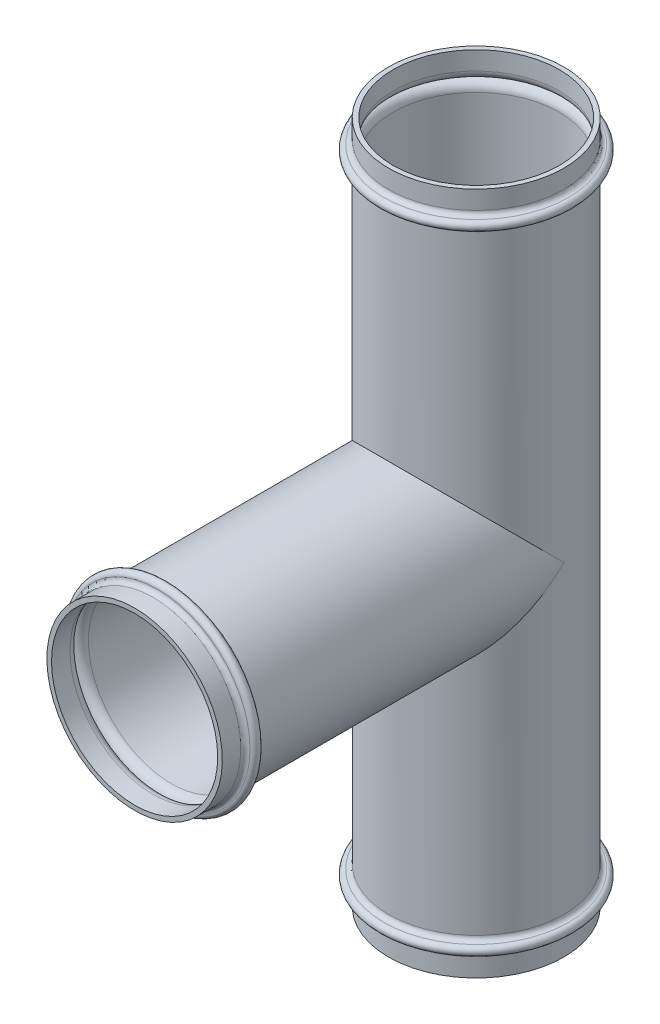
ISO-10303-21;
HEADER;
FILE_DESCRIPTION(('STEP AP214'),'2;1');
FILE_NAME('part.step','',(''),(''),'','','');
FILE_SCHEMA(('AUTOMOTIVE_DESIGN { 1 0 10303 214 1 1 1 1 }'));
ENDSEC;
DATA;
#1=APPLICATION_CONTEXT('core data for automotive mechanical design processes');
#2=APPLICATION_PROTOCOL_DEFINITION('international standard','automotive_design',2000,#1);
#3=PRODUCT_CONTEXT('',#1,'mechanical');
#4=PRODUCT('Part','Part','',(#3));
#5=PRODUCT_RELATED_PRODUCT_CATEGORY('part','',(#4));
#6=PRODUCT_DEFINITION_FORMATION('','',#4);
#7=PRODUCT_DEFINITION_CONTEXT('part definition',#1,'design');
#8=PRODUCT_DEFINITION('design','',#6,#7);
#9=PRODUCT_DEFINITION_SHAPE('','',#8);
#10=(LENGTH_UNIT() NAMED_UNIT(*) SI_UNIT(.MILLI.,.METRE.));
#11=(NAMED_UNIT(*) PLANE_ANGLE_UNIT() SI_UNIT($,.RADIAN.));
#12=(NAMED_UNIT(*) SI_UNIT($,.STERADIAN.) SOLID_ANGLE_UNIT());
#13=UNCERTAINTY_MEASURE_WITH_UNIT(LENGTH_MEASURE(1.E-05),#10,'distance_accuracy_value','');
#14=(GEOMETRIC_REPRESENTATION_CONTEXT(3) GLOBAL_UNCERTAINTY_ASSIGNED_CONTEXT((#13)) GLOBAL_UNIT_ASSIGNED_CONTEXT((#10,
#11,#12)) REPRESENTATION_CONTEXT('',''));
#15=CARTESIAN_POINT('',(0.,0.,0.));
#16=DIRECTION('',(0.,0.,1.));
#17=DIRECTION('',(1.,0.,0.));
#18=AXIS2_PLACEMENT_3D('',#15,#16,#17);
#19=CARTESIAN_POINT('',(-21.2059983387895,-23.8014786141053,0.));
#20=DIRECTION('',(0.,-1.,0.));
#21=DIRECTION('',(0.,0.,-1.));
#22=AXIS2_PLACEMENT_3D('',#19,#20,#21);
#23=CYLINDRICAL_SURFACE('',#22,9.5);
#24=CARTESIAN_POINT('',(-21.2059983387895,-23.8014786141053,0.));
#25=DIRECTION('',(0.,-0.707106781186549,0.707106781186546));
#26=DIRECTION('',(0.,-0.707106781186546,-0.707106781186549));
#27=AXIS2_PLACEMENT_3D('',#24,#25,#26);
#28=ELLIPSE('',#27,13.4350288425444,9.5);
#29=CARTESIAN_POINT('',(-11.7059983387895,-23.8014786141053,0.));
#30=VERTEX_POINT('',#29);
#31=CARTESIAN_POINT('',(-30.7059983387895,-23.8014786141053,0.));
#32=VERTEX_POINT('',#31);
#33=EDGE_CURVE('E48',#30,#32,#28,.T.);
#34=ORIENTED_EDGE('',*,*,#33,.F.);
#35=CARTESIAN_POINT('',(-21.2059983387895,-23.8014786141053,0.));
#36=DIRECTION('',(0.,-0.707106781186546,-0.707106781186549));
#37=DIRECTION('',(0.,0.707106781186549,-0.707106781186546));
#38=AXIS2_PLACEMENT_3D('',#35,#36,#37);
#39=ELLIPSE('',#38,13.4350288425444,9.5);
#40=EDGE_CURVE('E11',#30,#32,#39,.T.);
#41=ORIENTED_EDGE('',*,*,#40,.T.);
#42=EDGE_LOOP('',(#34,#41));
#43=FACE_BOUND('',#42,.T.);
#44=CARTESIAN_POINT('',(-21.2059983387895,9.19852138589467,0.));
#45=DIRECTION('',(0.,-1.,0.));
#46=DIRECTION('',(0.,0.,-1.));
#47=AXIS2_PLACEMENT_3D('',#44,#45,#46);
#48=CIRCLE('',#47,9.5);
#49=CARTESIAN_POINT('',(-21.2059983387895,9.19852138589467,-9.5));
#50=VERTEX_POINT('',#49);
#51=EDGE_CURVE('E151',#50,#50,#48,.T.);
#52=ORIENTED_EDGE('',*,*,#51,.T.);
#53=EDGE_LOOP('',(#52));
#54=FACE_BOUND('',#53,.T.);
#55=CARTESIAN_POINT('',(-21.2059983387895,-56.8014786141053,0.));
#56=DIRECTION('',(0.,1.,0.));
#57=DIRECTION('',(0.,0.,1.));
#58=AXIS2_PLACEMENT_3D('',#55,#56,#57);
#59=CIRCLE('',#58,9.5);
#60=CARTESIAN_POINT('',(-21.2059983387895,-56.8014786141053,9.5));
#61=VERTEX_POINT('',#60);
#62=EDGE_CURVE('E121',#61,#61,#59,.T.);
#63=ORIENTED_EDGE('',*,*,#62,.T.);
#64=EDGE_LOOP('',(#63));
#65=FACE_BOUND('',#64,.T.);
#66=ADVANCED_FACE('F41',(#43,#54,#65),#23,.T.);
#67=CARTESIAN_POINT('',(-21.2059983387895,9.19852138589467,0.));
#68=DIRECTION('',(0.,-1.,0.));
#69=DIRECTION('',(0.,0.,-1.));
#70=AXIS2_PLACEMENT_3D('',#67,#68,#69);
#71=TOROIDAL_SURFACE('',#70,10.,0.5);
#72=CARTESIAN_POINT('',(-21.2059983387895,9.69852138589467,0.));
#73=DIRECTION('',(0.,-1.,0.));
#74=DIRECTION('',(0.,0.,-1.));
#75=AXIS2_PLACEMENT_3D('',#72,#73,#74);
#76=CIRCLE('',#75,10.);
#77=CARTESIAN_POINT('',(-21.2059983387895,9.69852138589467,-10.));
#78=VERTEX_POINT('',#77);
#79=EDGE_CURVE('E148',#78,#78,#76,.T.);
#80=ORIENTED_EDGE('',*,*,#79,.T.);
#81=EDGE_LOOP('',(#80));
#82=FACE_BOUND('',#81,.T.);
#83=ORIENTED_EDGE('',*,*,#51,.F.);
#84=EDGE_LOOP('',(#83));
#85=FACE_BOUND('',#84,.T.);
#86=ADVANCED_FACE('F157',(#82,#85),#71,.F.);
#87=CARTESIAN_POINT('',(-21.2059983387895,10.1985213858947,0.));
#88=DIRECTION('',(0.,-1.,0.));
#89=DIRECTION('',(0.,0.,-1.));
#90=AXIS2_PLACEMENT_3D('',#87,#88,#89);
#91=TOROIDAL_SURFACE('',#90,10.,0.5);
#92=CARTESIAN_POINT('',(-21.2059983387895,10.6985213858947,0.));
#93=DIRECTION('',(0.,-1.,0.));
#94=DIRECTION('',(0.,0.,-1.));
#95=AXIS2_PLACEMENT_3D('',#92,#93,#94);
#96=CIRCLE('',#95,10.);
#97=CARTESIAN_POINT('',(-21.2059983387895,10.6985213858947,-10.));
#98=VERTEX_POINT('',#97);
#99=EDGE_CURVE('E145',#98,#98,#96,.T.);
#100=ORIENTED_EDGE('',*,*,#99,.T.);
#101=EDGE_LOOP('',(#100));
#102=FACE_BOUND('',#101,.T.);
#103=ORIENTED_EDGE('',*,*,#79,.F.);
#104=EDGE_LOOP('',(#103));
#105=FACE_BOUND('',#104,.T.);
#106=ADVANCED_FACE('F159',(#102,#105),#91,.T.);
#107=CARTESIAN_POINT('',(-21.2059983387895,11.1985213858947,0.));
#108=DIRECTION('',(0.,-1.,0.));
#109=DIRECTION('',(0.,0.,-1.));
#110=AXIS2_PLACEMENT_3D('',#107,#108,#109);
#111=TOROIDAL_SURFACE('',#110,10.,0.5);
#112=CARTESIAN_POINT('',(-21.2059983387895,11.1985213858947,0.));
#113=DIRECTION('',(0.,-1.,0.));
#114=DIRECTION('',(0.,0.,-1.));
#115=AXIS2_PLACEMENT_3D('',#112,#113,#114);
#116=CIRCLE('',#115,9.5);
#117=CARTESIAN_POINT('',(-21.2059983387895,11.1985213858947,-9.5));
#118=VERTEX_POINT('',#117);
#119=EDGE_CURVE('E142',#118,#118,#116,.T.);
#120=ORIENTED_EDGE('',*,*,#119,.T.);
#121=EDGE_LOOP('',(#120));
#122=FACE_BOUND('',#121,.T.);
#123=ORIENTED_EDGE('',*,*,#99,.F.);
#124=EDGE_LOOP('',(#123));
#125=FACE_BOUND('',#124,.T.);
#126=ADVANCED_FACE('F165',(#122,#125),#111,.F.);
#127=CARTESIAN_POINT('',(-21.2059983387895,-23.8014786141053,0.));
#128=DIRECTION('',(0.,-1.,0.));
#129=DIRECTION('',(0.,0.,-1.));
#130=AXIS2_PLACEMENT_3D('',#127,#128,#129);
#131=CYLINDRICAL_SURFACE('',#130,9.5);
#132=CARTESIAN_POINT('',(-21.2059983387895,13.1985213858947,0.));
#133=DIRECTION('',(0.,-1.,0.));
#134=DIRECTION('',(0.,0.,-1.));
#135=AXIS2_PLACEMENT_3D('',#132,#133,#134);
#136=CIRCLE('',#135,9.5);
#137=CARTESIAN_POINT('',(-21.2059983387895,13.1985213858947,-9.5));
#138=VERTEX_POINT('',#137);
#139=EDGE_CURVE('E139',#138,#138,#136,.T.);
#140=ORIENTED_EDGE('',*,*,#139,.T.);
#141=EDGE_LOOP('',(#140));
#142=FACE_BOUND('',#141,.T.);
#143=ORIENTED_EDGE('',*,*,#119,.F.);
#144=EDGE_LOOP('',(#143));
#145=FACE_BOUND('',#144,.T.);
#146=ADVANCED_FACE('F172',(#142,#145),#131,.T.);
#147=CARTESIAN_POINT('',(-21.2059983387895,13.1985213858947,0.));
#148=DIRECTION('',(0.,1.,0.));
#149=DIRECTION('',(0.,0.,1.));
#150=AXIS2_PLACEMENT_3D('',#147,#148,#149);
#151=PLANE('',#150);
#152=CARTESIAN_POINT('',(-21.2059983387895,13.1985213858947,0.));
#153=DIRECTION('',(0.,1.,0.));
#154=DIRECTION('',(0.,0.,1.));
#155=AXIS2_PLACEMENT_3D('',#152,#153,#154);
#156=CIRCLE('',#155,9.);
#157=CARTESIAN_POINT('',(-21.2059983387895,13.1985213858947,9.));
#158=VERTEX_POINT('',#157);
#159=EDGE_CURVE('E91',#158,#158,#156,.F.);
#160=ORIENTED_EDGE('',*,*,#159,.T.);
#161=EDGE_LOOP('',(#160));
#162=FACE_BOUND('',#161,.T.);
#163=ORIENTED_EDGE('',*,*,#139,.F.);
#164=EDGE_LOOP('',(#163));
#165=FACE_BOUND('',#164,.T.);
#166=ADVANCED_FACE('F176',(#162,#165),#151,.T.);
#167=CARTESIAN_POINT('',(-21.2059983387895,-23.8014786141053,0.));
#168=DIRECTION('',(0.,0.,-1.));
#169=DIRECTION('',(0.,1.,0.));
#170=AXIS2_PLACEMENT_3D('',#167,#168,#169);
#171=CYLINDRICAL_SURFACE('',#170,9.5);
#172=ORIENTED_EDGE('',*,*,#40,.F.);
#173=ORIENTED_EDGE('',*,*,#33,.T.);
#174=EDGE_LOOP('',(#172,#173));
#175=FACE_BOUND('',#174,.T.);
#176=CARTESIAN_POINT('',(-21.2059983387895,-23.8014786141054,33.));
#177=DIRECTION('',(0.,0.,-1.));
#178=DIRECTION('',(0.,1.,0.));
#179=AXIS2_PLACEMENT_3D('',#176,#177,#178);
#180=CIRCLE('',#179,9.5);
#181=CARTESIAN_POINT('',(-21.2059983387895,-14.3014786141054,33.));
#182=VERTEX_POINT('',#181);
#183=EDGE_CURVE('E136',#182,#182,#180,.T.);
#184=ORIENTED_EDGE('',*,*,#183,.T.);
#185=EDGE_LOOP('',(#184));
#186=FACE_BOUND('',#185,.T.);
#187=ADVANCED_FACE('F180',(#175,#186),#171,.T.);
#188=CARTESIAN_POINT('',(-21.2059983387895,-23.8014786141054,33.));
#189=DIRECTION('',(0.,0.,-1.));
#190=DIRECTION('',(0.,1.,0.));
#191=AXIS2_PLACEMENT_3D('',#188,#189,#190);
#192=TOROIDAL_SURFACE('',#191,10.,0.5);
#193=CARTESIAN_POINT('',(-21.2059983387895,-23.8014786141054,33.5));
#194=DIRECTION('',(0.,0.,-1.));
#195=DIRECTION('',(0.,1.,0.));
#196=AXIS2_PLACEMENT_3D('',#193,#194,#195);
#197=CIRCLE('',#196,10.);
#198=CARTESIAN_POINT('',(-21.2059983387895,-13.8014786141054,33.5));
#199=VERTEX_POINT('',#198);
#200=EDGE_CURVE('E133',#199,#199,#197,.T.);
#201=ORIENTED_EDGE('',*,*,#200,.T.);
#202=EDGE_LOOP('',(#201));
#203=FACE_BOUND('',#202,.T.);
#204=ORIENTED_EDGE('',*,*,#183,.F.);
#205=EDGE_LOOP('',(#204));
#206=FACE_BOUND('',#205,.T.);
#207=ADVANCED_FACE('F184',(#203,#206),#192,.F.);
#208=CARTESIAN_POINT('',(-21.2059983387895,-23.8014786141054,34.));
#209=DIRECTION('',(0.,0.,-1.));
#210=DIRECTION('',(0.,1.,0.));
#211=AXIS2_PLACEMENT_3D('',#208,#209,#210);
#212=TOROIDAL_SURFACE('',#211,10.,0.5);
#213=CARTESIAN_POINT('',(-21.2059983387895,-23.8014786141055,34.5));
#214=DIRECTION('',(0.,0.,-1.));
#215=DIRECTION('',(0.,1.,0.));
#216=AXIS2_PLACEMENT_3D('',#213,#214,#215);
#217=CIRCLE('',#216,10.);
#218=CARTESIAN_POINT('',(-21.2059983387895,-13.8014786141055,34.5));
#219=VERTEX_POINT('',#218);
#220=EDGE_CURVE('E130',#219,#219,#217,.T.);
#221=ORIENTED_EDGE('',*,*,#220,.T.);
#222=EDGE_LOOP('',(#221));
#223=FACE_BOUND('',#222,.T.);
#224=ORIENTED_EDGE('',*,*,#200,.F.);
#225=EDGE_LOOP('',(#224));
#226=FACE_BOUND('',#225,.T.);
#227=ADVANCED_FACE('F187',(#223,#226),#212,.T.);
#228=CARTESIAN_POINT('',(-21.2059983387895,-23.8014786141055,35.));
#229=DIRECTION('',(0.,0.,-1.));
#230=DIRECTION('',(0.,1.,0.));
#231=AXIS2_PLACEMENT_3D('',#228,#229,#230);
#232=TOROIDAL_SURFACE('',#231,10.,0.5);
#233=CARTESIAN_POINT('',(-21.2059983387895,-23.8014786141055,35.));
#234=DIRECTION('',(0.,0.,-1.));
#235=DIRECTION('',(0.,1.,0.));
#236=AXIS2_PLACEMENT_3D('',#233,#234,#235);
#237=CIRCLE('',#236,9.5);
#238=CARTESIAN_POINT('',(-21.2059983387895,-14.3014786141055,35.));
#239=VERTEX_POINT('',#238);
#240=EDGE_CURVE('E127',#239,#239,#237,.T.);
#241=ORIENTED_EDGE('',*,*,#240,.T.);
#242=EDGE_LOOP('',(#241));
#243=FACE_BOUND('',#242,.T.);
#244=ORIENTED_EDGE('',*,*,#220,.F.);
#245=EDGE_LOOP('',(#244));
#246=FACE_BOUND('',#245,.T.);
#247=ADVANCED_FACE('F191',(#243,#246),#232,.F.);
#248=CARTESIAN_POINT('',(-21.2059983387895,-23.8014786141053,0.));
#249=DIRECTION('',(0.,0.,-1.));
#250=DIRECTION('',(0.,1.,0.));
#251=AXIS2_PLACEMENT_3D('',#248,#249,#250);
#252=CYLINDRICAL_SURFACE('',#251,9.5);
#253=CARTESIAN_POINT('',(-21.2059983387895,-23.8014786141055,37.));
#254=DIRECTION('',(0.,0.,-1.));
#255=DIRECTION('',(0.,1.,0.));
#256=AXIS2_PLACEMENT_3D('',#253,#254,#255);
#257=CIRCLE('',#256,9.5);
#258=CARTESIAN_POINT('',(-21.2059983387895,-14.3014786141055,37.));
#259=VERTEX_POINT('',#258);
#260=EDGE_CURVE('E124',#259,#259,#257,.T.);
#261=ORIENTED_EDGE('',*,*,#260,.T.);
#262=EDGE_LOOP('',(#261));
#263=FACE_BOUND('',#262,.T.);
#264=ORIENTED_EDGE('',*,*,#240,.F.);
#265=EDGE_LOOP('',(#264));
#266=FACE_BOUND('',#265,.T.);
#267=ADVANCED_FACE('F195',(#263,#266),#252,.T.);
#268=CARTESIAN_POINT('',(-21.2059983387895,-23.8014786141055,37.));
#269=DIRECTION('',(0.,0.,1.));
#270=DIRECTION('',(0.,-1.,0.));
#271=AXIS2_PLACEMENT_3D('',#268,#269,#270);
#272=PLANE('',#271);
#273=CARTESIAN_POINT('',(-21.2059983387895,-23.8014786141055,37.));
#274=DIRECTION('',(0.,0.,1.));
#275=DIRECTION('',(0.,-1.,0.));
#276=AXIS2_PLACEMENT_3D('',#273,#274,#275);
#277=CIRCLE('',#276,9.);
#278=CARTESIAN_POINT('',(-21.2059983387895,-32.8014786141055,37.));
#279=VERTEX_POINT('',#278);
#280=EDGE_CURVE('E84',#279,#279,#277,.F.);
#281=ORIENTED_EDGE('',*,*,#280,.T.);
#282=EDGE_LOOP('',(#281));
#283=FACE_BOUND('',#282,.T.);
#284=ORIENTED_EDGE('',*,*,#260,.F.);
#285=EDGE_LOOP('',(#284));
#286=FACE_BOUND('',#285,.T.);
#287=ADVANCED_FACE('F199',(#283,#286),#272,.T.);
#288=CARTESIAN_POINT('',(-21.2059983387895,-56.8014786141053,0.));
#289=DIRECTION('',(0.,1.,0.));
#290=DIRECTION('',(0.,0.,1.));
#291=AXIS2_PLACEMENT_3D('',#288,#289,#290);
#292=TOROIDAL_SURFACE('',#291,10.,0.5);
#293=CARTESIAN_POINT('',(-21.2059983387895,-57.3014786141053,0.));
#294=DIRECTION('',(0.,1.,0.));
#295=DIRECTION('',(0.,0.,1.));
#296=AXIS2_PLACEMENT_3D('',#293,#294,#295);
#297=CIRCLE('',#296,10.);
#298=CARTESIAN_POINT('',(-21.2059983387895,-57.3014786141053,10.));
#299=VERTEX_POINT('',#298);
#300=EDGE_CURVE('E118',#299,#299,#297,.T.);
#301=ORIENTED_EDGE('',*,*,#300,.T.);
#302=EDGE_LOOP('',(#301));
#303=FACE_BOUND('',#302,.T.);
#304=ORIENTED_EDGE('',*,*,#62,.F.);
#305=EDGE_LOOP('',(#304));
#306=FACE_BOUND('',#305,.T.);
#307=ADVANCED_FACE('F203',(#303,#306),#292,.F.);
#308=CARTESIAN_POINT('',(-21.2059983387895,-57.8014786141053,0.));
#309=DIRECTION('',(0.,1.,0.));
#310=DIRECTION('',(0.,0.,1.));
#311=AXIS2_PLACEMENT_3D('',#308,#309,#310);
#312=TOROIDAL_SURFACE('',#311,10.,0.5);
#313=CARTESIAN_POINT('',(-21.2059983387895,-58.3014786141053,0.));
#314=DIRECTION('',(0.,1.,0.));
#315=DIRECTION('',(0.,0.,1.));
#316=AXIS2_PLACEMENT_3D('',#313,#314,#315);
#317=CIRCLE('',#316,10.);
#318=CARTESIAN_POINT('',(-21.2059983387895,-58.3014786141053,10.));
#319=VERTEX_POINT('',#318);
#320=EDGE_CURVE('E115',#319,#319,#317,.T.);
#321=ORIENTED_EDGE('',*,*,#320,.T.);
#322=EDGE_LOOP('',(#321));
#323=FACE_BOUND('',#322,.T.);
#324=ORIENTED_EDGE('',*,*,#300,.F.);
#325=EDGE_LOOP('',(#324));
#326=FACE_BOUND('',#325,.T.);
#327=ADVANCED_FACE('F207',(#323,#326),#312,.T.);
#328=CARTESIAN_POINT('',(-21.2059983387895,-58.8014786141053,0.));
#329=DIRECTION('',(0.,1.,0.));
#330=DIRECTION('',(0.,0.,1.));
#331=AXIS2_PLACEMENT_3D('',#328,#329,#330);
#332=TOROIDAL_SURFACE('',#331,10.,0.5);
#333=CARTESIAN_POINT('',(-21.2059983387895,-58.8014786141053,0.));
#334=DIRECTION('',(0.,1.,0.));
#335=DIRECTION('',(0.,0.,1.));
#336=AXIS2_PLACEMENT_3D('',#333,#334,#335);
#337=CIRCLE('',#336,9.5);
#338=CARTESIAN_POINT('',(-21.2059983387895,-58.8014786141053,9.5));
#339=VERTEX_POINT('',#338);
#340=EDGE_CURVE('E75',#339,#339,#337,.T.);
#341=ORIENTED_EDGE('',*,*,#340,.T.);
#342=EDGE_LOOP('',(#341));
#343=FACE_BOUND('',#342,.T.);
#344=ORIENTED_EDGE('',*,*,#320,.F.);
#345=EDGE_LOOP('',(#344));
#346=FACE_BOUND('',#345,.T.);
#347=ADVANCED_FACE('F211',(#343,#346),#332,.F.);
#348=CARTESIAN_POINT('',(-21.2059983387895,-23.8014786141053,0.));
#349=DIRECTION('',(0.,1.,0.));
#350=DIRECTION('',(0.,0.,1.));
#351=AXIS2_PLACEMENT_3D('',#348,#349,#350);
#352=CYLINDRICAL_SURFACE('',#351,9.5);
#353=CARTESIAN_POINT('',(-21.2059983387895,-60.8014786141053,0.));
#354=DIRECTION('',(0.,1.,0.));
#355=DIRECTION('',(0.,0.,1.));
#356=AXIS2_PLACEMENT_3D('',#353,#354,#355);
#357=CIRCLE('',#356,9.5);
#358=CARTESIAN_POINT('',(-21.2059983387895,-60.8014786141053,9.5));
#359=VERTEX_POINT('',#358);
#360=EDGE_CURVE('E72',#359,#359,#357,.T.);
#361=ORIENTED_EDGE('',*,*,#360,.T.);
#362=EDGE_LOOP('',(#361));
#363=FACE_BOUND('',#362,.T.);
#364=ORIENTED_EDGE('',*,*,#340,.F.);
#365=EDGE_LOOP('',(#364));
#366=FACE_BOUND('',#365,.T.);
#367=ADVANCED_FACE('F215',(#363,#366),#352,.T.);
#368=CARTESIAN_POINT('',(-21.2059983387895,-60.8014786141053,0.));
#369=DIRECTION('',(0.,-1.,0.));
#370=DIRECTION('',(0.,0.,-1.));
#371=AXIS2_PLACEMENT_3D('',#368,#369,#370);
#372=PLANE('',#371);
#373=CARTESIAN_POINT('',(-21.2059983387895,-60.8014786141053,0.));
#374=DIRECTION('',(0.,-1.,0.));
#375=DIRECTION('',(0.,0.,-1.));
#376=AXIS2_PLACEMENT_3D('',#373,#374,#375);
#377=CIRCLE('',#376,9.);
#378=CARTESIAN_POINT('',(-21.2059983387895,-60.8014786141053,-9.));
#379=VERTEX_POINT('',#378);
#380=EDGE_CURVE('E106',#379,#379,#377,.F.);
#381=ORIENTED_EDGE('',*,*,#380,.T.);
#382=EDGE_LOOP('',(#381));
#383=FACE_BOUND('',#382,.T.);
#384=ORIENTED_EDGE('',*,*,#360,.F.);
#385=EDGE_LOOP('',(#384));
#386=FACE_BOUND('',#385,.T.);
#387=ADVANCED_FACE('F219',(#383,#386),#372,.T.);
#388=CARTESIAN_POINT('',(-21.2059983387895,-23.8014786141053,0.));
#389=DIRECTION('',(0.,-1.,0.));
#390=DIRECTION('',(0.,0.,-1.));
#391=AXIS2_PLACEMENT_3D('',#388,#389,#390);
#392=CYLINDRICAL_SURFACE('',#391,9.);
#393=CARTESIAN_POINT('',(-21.2059983387895,-23.8014786141053,0.));
#394=DIRECTION('',(0.,-0.707106781186549,0.707106781186546));
#395=DIRECTION('',(0.,-0.707106781186546,-0.707106781186549));
#396=AXIS2_PLACEMENT_3D('',#393,#394,#395);
#397=ELLIPSE('',#396,12.7279220613578,9.);
#398=CARTESIAN_POINT('',(-12.2059983387895,-23.8014786141053,0.));
#399=VERTEX_POINT('',#398);
#400=CARTESIAN_POINT('',(-30.2059983387895,-23.8014786141053,0.));
#401=VERTEX_POINT('',#400);
#402=EDGE_CURVE('E62',#399,#401,#397,.T.);
#403=ORIENTED_EDGE('',*,*,#402,.T.);
#404=CARTESIAN_POINT('',(-21.2059983387895,-23.8014786141053,0.));
#405=DIRECTION('',(0.,-0.707106781186546,-0.707106781186549));
#406=DIRECTION('',(0.,0.707106781186549,-0.707106781186546));
#407=AXIS2_PLACEMENT_3D('',#404,#405,#406);
#408=ELLIPSE('',#407,12.7279220613579,9.);
#409=EDGE_CURVE('E66',#399,#401,#408,.T.);
#410=ORIENTED_EDGE('',*,*,#409,.F.);
#411=EDGE_LOOP('',(#403,#410));
#412=FACE_BOUND('',#411,.T.);
#413=CARTESIAN_POINT('',(-21.2059983387895,9.19852138589467,0.));
#414=DIRECTION('',(0.,-1.,0.));
#415=DIRECTION('',(0.,0.,-1.));
#416=AXIS2_PLACEMENT_3D('',#413,#414,#415);
#417=CIRCLE('',#416,9.);
#418=CARTESIAN_POINT('',(-21.2059983387895,9.19852138589467,-9.));
#419=VERTEX_POINT('',#418);
#420=EDGE_CURVE('E68',#419,#419,#417,.T.);
#421=ORIENTED_EDGE('',*,*,#420,.F.);
#422=EDGE_LOOP('',(#421));
#423=FACE_BOUND('',#422,.T.);
#424=CARTESIAN_POINT('',(-21.2059983387895,-56.8014786141053,0.));
#425=DIRECTION('',(0.,-1.,0.));
#426=DIRECTION('',(0.,0.,-1.));
#427=AXIS2_PLACEMENT_3D('',#424,#425,#426);
#428=CIRCLE('',#427,9.);
#429=CARTESIAN_POINT('',(-21.2059983387895,-56.8014786141053,-9.));
#430=VERTEX_POINT('',#429);
#431=EDGE_CURVE('E81',#430,#430,#428,.F.);
#432=ORIENTED_EDGE('',*,*,#431,.F.);
#433=EDGE_LOOP('',(#432));
#434=FACE_BOUND('',#433,.T.);
#435=ADVANCED_FACE('F64',(#412,#423,#434),#392,.F.);
#436=CARTESIAN_POINT('',(-21.2059983387895,9.19852138589467,0.));
#437=DIRECTION('',(0.,-1.,0.));
#438=DIRECTION('',(0.,0.,-1.));
#439=AXIS2_PLACEMENT_3D('',#436,#437,#438);
#440=TOROIDAL_SURFACE('',#439,10.,1.);
#441=CARTESIAN_POINT('',(-21.2059983387895,10.1985213858947,0.));
#442=DIRECTION('',(0.,-1.,0.));
#443=DIRECTION('',(0.,0.,-1.));
#444=AXIS2_PLACEMENT_3D('',#441,#442,#443);
#445=CIRCLE('',#444,10.);
#446=CARTESIAN_POINT('',(-21.2059983387895,10.1985213858947,-10.));
#447=VERTEX_POINT('',#446);
#448=EDGE_CURVE('E80',#447,#447,#445,.T.);
#449=ORIENTED_EDGE('',*,*,#448,.F.);
#450=EDGE_LOOP('',(#449));
#451=FACE_BOUND('',#450,.T.);
#452=ORIENTED_EDGE('',*,*,#420,.T.);
#453=EDGE_LOOP('',(#452));
#454=FACE_BOUND('',#453,.T.);
#455=ADVANCED_FACE('F257',(#451,#454),#440,.T.);
#456=CARTESIAN_POINT('',(-21.2059983387895,11.1985213858947,0.));
#457=DIRECTION('',(0.,-1.,0.));
#458=DIRECTION('',(0.,0.,-1.));
#459=AXIS2_PLACEMENT_3D('',#456,#457,#458);
#460=TOROIDAL_SURFACE('',#459,10.,1.);
#461=CARTESIAN_POINT('',(-21.2059983387895,11.1985213858947,0.));
#462=DIRECTION('',(0.,-1.,0.));
#463=DIRECTION('',(0.,0.,-1.));
#464=AXIS2_PLACEMENT_3D('',#461,#462,#463);
#465=CIRCLE('',#464,9.);
#466=CARTESIAN_POINT('',(-21.2059983387895,11.1985213858947,-9.));
#467=VERTEX_POINT('',#466);
#468=EDGE_CURVE('E88',#467,#467,#465,.T.);
#469=ORIENTED_EDGE('',*,*,#468,.F.);
#470=EDGE_LOOP('',(#469));
#471=FACE_BOUND('',#470,.T.);
#472=ORIENTED_EDGE('',*,*,#448,.T.);
#473=EDGE_LOOP('',(#472));
#474=FACE_BOUND('',#473,.T.);
#475=ADVANCED_FACE('F253',(#471,#474),#460,.T.);
#476=CARTESIAN_POINT('',(-21.2059983387895,-23.8014786141053,0.));
#477=DIRECTION('',(0.,-1.,0.));
#478=DIRECTION('',(0.,0.,-1.));
#479=AXIS2_PLACEMENT_3D('',#476,#477,#478);
#480=CYLINDRICAL_SURFACE('',#479,9.);
#481=ORIENTED_EDGE('',*,*,#159,.F.);
#482=EDGE_LOOP('',(#481));
#483=FACE_BOUND('',#482,.T.);
#484=ORIENTED_EDGE('',*,*,#468,.T.);
#485=EDGE_LOOP('',(#484));
#486=FACE_BOUND('',#485,.T.);
#487=ADVANCED_FACE('F250',(#483,#486),#480,.F.);
#488=CARTESIAN_POINT('',(-21.2059983387895,-23.8014786141053,0.));
#489=DIRECTION('',(0.,0.,-1.));
#490=DIRECTION('',(0.,1.,0.));
#491=AXIS2_PLACEMENT_3D('',#488,#489,#490);
#492=CYLINDRICAL_SURFACE('',#491,9.);
#493=ORIENTED_EDGE('',*,*,#409,.T.);
#494=ORIENTED_EDGE('',*,*,#402,.F.);
#495=EDGE_LOOP('',(#493,#494));
#496=FACE_BOUND('',#495,.T.);
#497=CARTESIAN_POINT('',(-21.2059983387895,-23.8014786141054,33.));
#498=DIRECTION('',(0.,0.,-1.));
#499=DIRECTION('',(0.,1.,0.));
#500=AXIS2_PLACEMENT_3D('',#497,#498,#499);
#501=CIRCLE('',#500,9.);
#502=CARTESIAN_POINT('',(-21.2059983387895,-14.8014786141054,33.));
#503=VERTEX_POINT('',#502);
#504=EDGE_CURVE('E92',#503,#503,#501,.T.);
#505=ORIENTED_EDGE('',*,*,#504,.F.);
#506=EDGE_LOOP('',(#505));
#507=FACE_BOUND('',#506,.T.);
#508=ADVANCED_FACE('F70',(#496,#507),#492,.F.);
#509=CARTESIAN_POINT('',(-21.2059983387895,-23.8014786141054,33.));
#510=DIRECTION('',(0.,0.,-1.));
#511=DIRECTION('',(0.,1.,0.));
#512=AXIS2_PLACEMENT_3D('',#509,#510,#511);
#513=TOROIDAL_SURFACE('',#512,10.,1.);
#514=CARTESIAN_POINT('',(-21.2059983387895,-23.8014786141054,34.));
#515=DIRECTION('',(0.,0.,-1.));
#516=DIRECTION('',(0.,1.,0.));
#517=AXIS2_PLACEMENT_3D('',#514,#515,#516);
#518=CIRCLE('',#517,10.);
#519=CARTESIAN_POINT('',(-21.2059983387895,-13.8014786141054,34.));
#520=VERTEX_POINT('',#519);
#521=EDGE_CURVE('E95',#520,#520,#518,.T.);
#522=ORIENTED_EDGE('',*,*,#521,.F.);
#523=EDGE_LOOP('',(#522));
#524=FACE_BOUND('',#523,.T.);
#525=ORIENTED_EDGE('',*,*,#504,.T.);
#526=EDGE_LOOP('',(#525));
#527=FACE_BOUND('',#526,.T.);
#528=ADVANCED_FACE('F243',(#524,#527),#513,.T.);
#529=CARTESIAN_POINT('',(-21.2059983387895,-23.8014786141055,35.));
#530=DIRECTION('',(0.,0.,-1.));
#531=DIRECTION('',(0.,1.,0.));
#532=AXIS2_PLACEMENT_3D('',#529,#530,#531);
#533=TOROIDAL_SURFACE('',#532,10.,1.);
#534=CARTESIAN_POINT('',(-21.2059983387895,-23.8014786141055,35.));
#535=DIRECTION('',(0.,0.,-1.));
#536=DIRECTION('',(0.,1.,0.));
#537=AXIS2_PLACEMENT_3D('',#534,#535,#536);
#538=CIRCLE('',#537,9.);
#539=CARTESIAN_POINT('',(-21.2059983387895,-14.8014786141055,35.));
#540=VERTEX_POINT('',#539);
#541=EDGE_CURVE('E98',#540,#540,#538,.T.);
#542=ORIENTED_EDGE('',*,*,#541,.F.);
#543=EDGE_LOOP('',(#542));
#544=FACE_BOUND('',#543,.T.);
#545=ORIENTED_EDGE('',*,*,#521,.T.);
#546=EDGE_LOOP('',(#545));
#547=FACE_BOUND('',#546,.T.);
#548=ADVANCED_FACE('F239',(#544,#547),#533,.T.);
#549=CARTESIAN_POINT('',(-21.2059983387895,-23.8014786141053,0.));
#550=DIRECTION('',(0.,0.,-1.));
#551=DIRECTION('',(0.,1.,0.));
#552=AXIS2_PLACEMENT_3D('',#549,#550,#551);
#553=CYLINDRICAL_SURFACE('',#552,9.);
#554=ORIENTED_EDGE('',*,*,#280,.F.);
#555=EDGE_LOOP('',(#554));
#556=FACE_BOUND('',#555,.T.);
#557=ORIENTED_EDGE('',*,*,#541,.T.);
#558=EDGE_LOOP('',(#557));
#559=FACE_BOUND('',#558,.T.);
#560=ADVANCED_FACE('F235',(#556,#559),#553,.F.);
#561=CARTESIAN_POINT('',(-21.2059983387895,-56.8014786141053,0.));
#562=DIRECTION('',(0.,1.,0.));
#563=DIRECTION('',(0.,0.,1.));
#564=AXIS2_PLACEMENT_3D('',#561,#562,#563);
#565=TOROIDAL_SURFACE('',#564,10.,1.);
#566=CARTESIAN_POINT('',(-21.2059983387895,-57.8014786141053,0.));
#567=DIRECTION('',(0.,1.,0.));
#568=DIRECTION('',(0.,0.,1.));
#569=AXIS2_PLACEMENT_3D('',#566,#567,#568);
#570=CIRCLE('',#569,10.);
#571=CARTESIAN_POINT('',(-21.2059983387895,-57.8014786141053,10.));
#572=VERTEX_POINT('',#571);
#573=EDGE_CURVE('E85',#572,#572,#570,.T.);
#574=ORIENTED_EDGE('',*,*,#573,.F.);
#575=EDGE_LOOP('',(#574));
#576=FACE_BOUND('',#575,.T.);
#577=ORIENTED_EDGE('',*,*,#431,.T.);
#578=EDGE_LOOP('',(#577));
#579=FACE_BOUND('',#578,.T.);
#580=ADVANCED_FACE('F231',(#576,#579),#565,.T.);
#581=CARTESIAN_POINT('',(-21.2059983387895,-58.8014786141053,0.));
#582=DIRECTION('',(0.,1.,0.));
#583=DIRECTION('',(0.,0.,1.));
#584=AXIS2_PLACEMENT_3D('',#581,#582,#583);
#585=TOROIDAL_SURFACE('',#584,10.,1.);
#586=CARTESIAN_POINT('',(-21.2059983387895,-58.8014786141053,0.));
#587=DIRECTION('',(0.,1.,0.));
#588=DIRECTION('',(0.,0.,1.));
#589=AXIS2_PLACEMENT_3D('',#586,#587,#588);
#590=CIRCLE('',#589,9.);
#591=CARTESIAN_POINT('',(-21.2059983387895,-58.8014786141053,9.));
#592=VERTEX_POINT('',#591);
#593=EDGE_CURVE('E103',#592,#592,#590,.T.);
#594=ORIENTED_EDGE('',*,*,#593,.F.);
#595=EDGE_LOOP('',(#594));
#596=FACE_BOUND('',#595,.T.);
#597=ORIENTED_EDGE('',*,*,#573,.T.);
#598=EDGE_LOOP('',(#597));
#599=FACE_BOUND('',#598,.T.);
#600=ADVANCED_FACE('F227',(#596,#599),#585,.T.);
#601=CARTESIAN_POINT('',(-21.2059983387895,-23.8014786141053,0.));
#602=DIRECTION('',(0.,1.,0.));
#603=DIRECTION('',(0.,0.,1.));
#604=AXIS2_PLACEMENT_3D('',#601,#602,#603);
#605=CYLINDRICAL_SURFACE('',#604,9.);
#606=ORIENTED_EDGE('',*,*,#380,.F.);
#607=EDGE_LOOP('',(#606));
#608=FACE_BOUND('',#607,.T.);
#609=ORIENTED_EDGE('',*,*,#593,.T.);
#610=EDGE_LOOP('',(#609));
#611=FACE_BOUND('',#610,.T.);
#612=ADVANCED_FACE('F224',(#608,#611),#605,.F.);
#613=CLOSED_SHELL('',(#66,#86,#106,#126,#146,#166,#187,#207,#227,#247,#267,#287,#307,#327,#347,
#367,#387,#435,#455,#475,#487,#508,#528,#548,#560,#580,#600,#612));
#614=MANIFOLD_SOLID_BREP('B2',#613);
#615=ADVANCED_BREP_SHAPE_REPRESENTATION('',(#18,#614),#14);
#616=SHAPE_DEFINITION_REPRESENTATION(#9,#615);
ENDSEC;
END-ISO-10303-21;
